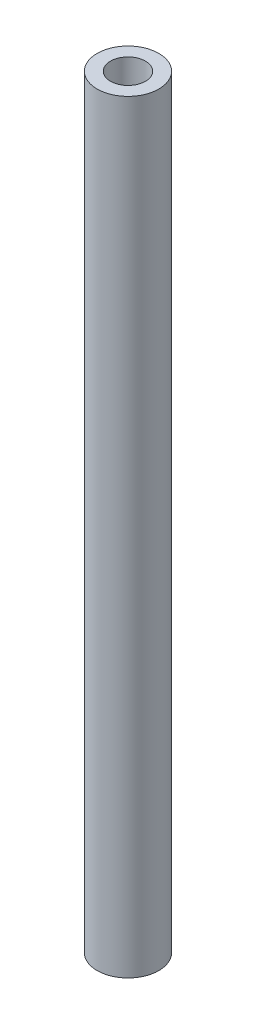
ISO-10303-21;
HEADER;
FILE_DESCRIPTION(('STEP AP214'),'2;1');
FILE_NAME('part.step','',(''),(''),'','','');
FILE_SCHEMA(('AUTOMOTIVE_DESIGN { 1 0 10303 214 1 1 1 1 }'));
ENDSEC;
DATA;
#1=APPLICATION_CONTEXT('core data for automotive mechanical design processes');
#2=APPLICATION_PROTOCOL_DEFINITION('international standard','automotive_design',2000,#1);
#3=PRODUCT_CONTEXT('',#1,'mechanical');
#4=PRODUCT('Part','Part','',(#3));
#5=PRODUCT_RELATED_PRODUCT_CATEGORY('part','',(#4));
#6=PRODUCT_DEFINITION_FORMATION('','',#4);
#7=PRODUCT_DEFINITION_CONTEXT('part definition',#1,'design');
#8=PRODUCT_DEFINITION('design','',#6,#7);
#9=PRODUCT_DEFINITION_SHAPE('','',#8);
#10=(LENGTH_UNIT() NAMED_UNIT(*) SI_UNIT(.MILLI.,.METRE.));
#11=(NAMED_UNIT(*) PLANE_ANGLE_UNIT() SI_UNIT($,.RADIAN.));
#12=(NAMED_UNIT(*) SI_UNIT($,.STERADIAN.) SOLID_ANGLE_UNIT());
#13=UNCERTAINTY_MEASURE_WITH_UNIT(LENGTH_MEASURE(1.E-05),#10,'distance_accuracy_value','');
#14=(GEOMETRIC_REPRESENTATION_CONTEXT(3) GLOBAL_UNCERTAINTY_ASSIGNED_CONTEXT((#13)) GLOBAL_UNIT_ASSIGNED_CONTEXT((#10,
#11,#12)) REPRESENTATION_CONTEXT('',''));
#15=CARTESIAN_POINT('',(0.,0.,0.));
#16=DIRECTION('',(0.,0.,1.));
#17=DIRECTION('',(1.,0.,0.));
#18=AXIS2_PLACEMENT_3D('',#15,#16,#17);
#19=CARTESIAN_POINT('',(0.,60.,0.));
#20=DIRECTION('',(0.,-1.,0.));
#21=DIRECTION('',(0.,0.,-1.));
#22=AXIS2_PLACEMENT_3D('',#19,#20,#21);
#23=CYLINDRICAL_SURFACE('',#22,2.425);
#24=CARTESIAN_POINT('',(0.,60.,0.));
#25=DIRECTION('',(0.,1.,0.));
#26=DIRECTION('',(0.,0.,1.));
#27=AXIS2_PLACEMENT_3D('',#24,#25,#26);
#28=CIRCLE('',#27,2.425);
#29=CARTESIAN_POINT('',(0.,60.,2.425));
#30=VERTEX_POINT('',#29);
#31=EDGE_CURVE('E10',#30,#30,#28,.T.);
#32=ORIENTED_EDGE('',*,*,#31,.F.);
#33=EDGE_LOOP('',(#32));
#34=FACE_BOUND('',#33,.T.);
#35=CARTESIAN_POINT('',(0.,0.,0.));
#36=DIRECTION('',(0.,1.,0.));
#37=DIRECTION('',(0.,0.,1.));
#38=AXIS2_PLACEMENT_3D('',#35,#36,#37);
#39=CIRCLE('',#38,2.425);
#40=CARTESIAN_POINT('',(0.,0.,2.425));
#41=VERTEX_POINT('',#40);
#42=EDGE_CURVE('E37',#41,#41,#39,.T.);
#43=ORIENTED_EDGE('',*,*,#42,.T.);
#44=EDGE_LOOP('',(#43));
#45=FACE_BOUND('',#44,.T.);
#46=ADVANCED_FACE('F34',(#34,#45),#23,.T.);
#47=CARTESIAN_POINT('',(0.,60.,0.));
#48=DIRECTION('',(0.,1.,0.));
#49=DIRECTION('',(0.,0.,1.));
#50=AXIS2_PLACEMENT_3D('',#47,#48,#49);
#51=PLANE('',#50);
#52=CARTESIAN_POINT('',(0.,60.,0.));
#53=DIRECTION('',(0.,1.,0.));
#54=DIRECTION('',(0.,0.,1.));
#55=AXIS2_PLACEMENT_3D('',#52,#53,#54);
#56=CIRCLE('',#55,1.375);
#57=CARTESIAN_POINT('',(0.,60.,1.375));
#58=VERTEX_POINT('',#57);
#59=EDGE_CURVE('E46',#58,#58,#56,.T.);
#60=ORIENTED_EDGE('',*,*,#59,.F.);
#61=EDGE_LOOP('',(#60));
#62=FACE_BOUND('',#61,.T.);
#63=ORIENTED_EDGE('',*,*,#31,.T.);
#64=EDGE_LOOP('',(#63));
#65=FACE_BOUND('',#64,.T.);
#66=ADVANCED_FACE('F70',(#62,#65),#51,.T.);
#67=CARTESIAN_POINT('',(0.,0.,0.));
#68=DIRECTION('',(0.,1.,0.));
#69=DIRECTION('',(0.,0.,1.));
#70=AXIS2_PLACEMENT_3D('',#67,#68,#69);
#71=PLANE('',#70);
#72=CARTESIAN_POINT('',(0.,0.,0.));
#73=DIRECTION('',(0.,1.,0.));
#74=DIRECTION('',(0.,0.,1.));
#75=AXIS2_PLACEMENT_3D('',#72,#73,#74);
#76=CIRCLE('',#75,1.375);
#77=CARTESIAN_POINT('',(0.,0.,1.375));
#78=VERTEX_POINT('',#77);
#79=EDGE_CURVE('E52',#78,#78,#76,.T.);
#80=ORIENTED_EDGE('',*,*,#79,.T.);
#81=EDGE_LOOP('',(#80));
#82=FACE_BOUND('',#81,.T.);
#83=ORIENTED_EDGE('',*,*,#42,.F.);
#84=EDGE_LOOP('',(#83));
#85=FACE_BOUND('',#84,.T.);
#86=ADVANCED_FACE('F75',(#82,#85),#71,.F.);
#87=CARTESIAN_POINT('',(0.,49.,0.));
#88=DIRECTION('',(0.,1.,0.));
#89=DIRECTION('',(0.,0.,1.));
#90=AXIS2_PLACEMENT_3D('',#87,#88,#89);
#91=CYLINDRICAL_SURFACE('',#90,1.375);
#92=CARTESIAN_POINT('',(0.,49.,0.));
#93=DIRECTION('',(0.,1.,0.));
#94=DIRECTION('',(0.,0.,1.));
#95=AXIS2_PLACEMENT_3D('',#92,#93,#94);
#96=CIRCLE('',#95,1.375);
#97=CARTESIAN_POINT('',(0.,49.,1.375));
#98=VERTEX_POINT('',#97);
#99=EDGE_CURVE('E44',#98,#98,#96,.T.);
#100=ORIENTED_EDGE('',*,*,#99,.F.);
#101=EDGE_LOOP('',(#100));
#102=FACE_BOUND('',#101,.T.);
#103=ORIENTED_EDGE('',*,*,#59,.T.);
#104=EDGE_LOOP('',(#103));
#105=FACE_BOUND('',#104,.T.);
#106=ADVANCED_FACE('F82',(#102,#105),#91,.F.);
#107=CARTESIAN_POINT('',(0.,49.,0.));
#108=DIRECTION('',(0.,1.,0.));
#109=DIRECTION('',(0.,0.,1.));
#110=AXIS2_PLACEMENT_3D('',#107,#108,#109);
#111=PLANE('',#110);
#112=ORIENTED_EDGE('',*,*,#99,.T.);
#113=EDGE_LOOP('',(#112));
#114=FACE_BOUND('',#113,.T.);
#115=ADVANCED_FACE('F67',(#114),#111,.T.);
#116=CARTESIAN_POINT('',(0.,11.,0.));
#117=DIRECTION('',(0.,-1.,0.));
#118=DIRECTION('',(0.,0.,-1.));
#119=AXIS2_PLACEMENT_3D('',#116,#117,#118);
#120=CYLINDRICAL_SURFACE('',#119,1.375);
#121=CARTESIAN_POINT('',(0.,11.,0.));
#122=DIRECTION('',(0.,1.,0.));
#123=DIRECTION('',(0.,0.,1.));
#124=AXIS2_PLACEMENT_3D('',#121,#122,#123);
#125=CIRCLE('',#124,1.375);
#126=CARTESIAN_POINT('',(0.,11.,1.375));
#127=VERTEX_POINT('',#126);
#128=EDGE_CURVE('E49',#127,#127,#125,.T.);
#129=ORIENTED_EDGE('',*,*,#128,.T.);
#130=EDGE_LOOP('',(#129));
#131=FACE_BOUND('',#130,.T.);
#132=ORIENTED_EDGE('',*,*,#79,.F.);
#133=EDGE_LOOP('',(#132));
#134=FACE_BOUND('',#133,.T.);
#135=ADVANCED_FACE('F58',(#131,#134),#120,.F.);
#136=CARTESIAN_POINT('',(0.,11.,0.));
#137=DIRECTION('',(0.,1.,0.));
#138=DIRECTION('',(0.,0.,1.));
#139=AXIS2_PLACEMENT_3D('',#136,#137,#138);
#140=PLANE('',#139);
#141=ORIENTED_EDGE('',*,*,#128,.F.);
#142=EDGE_LOOP('',(#141));
#143=FACE_BOUND('',#142,.T.);
#144=ADVANCED_FACE('F61',(#143),#140,.F.);
#145=CLOSED_SHELL('',(#46,#66,#86,#106,#115,#135,#144));
#146=MANIFOLD_SOLID_BREP('B2',#145);
#147=ADVANCED_BREP_SHAPE_REPRESENTATION('',(#18,#146),#14);
#148=SHAPE_DEFINITION_REPRESENTATION(#9,#147);
ENDSEC;
END-ISO-10303-21;
